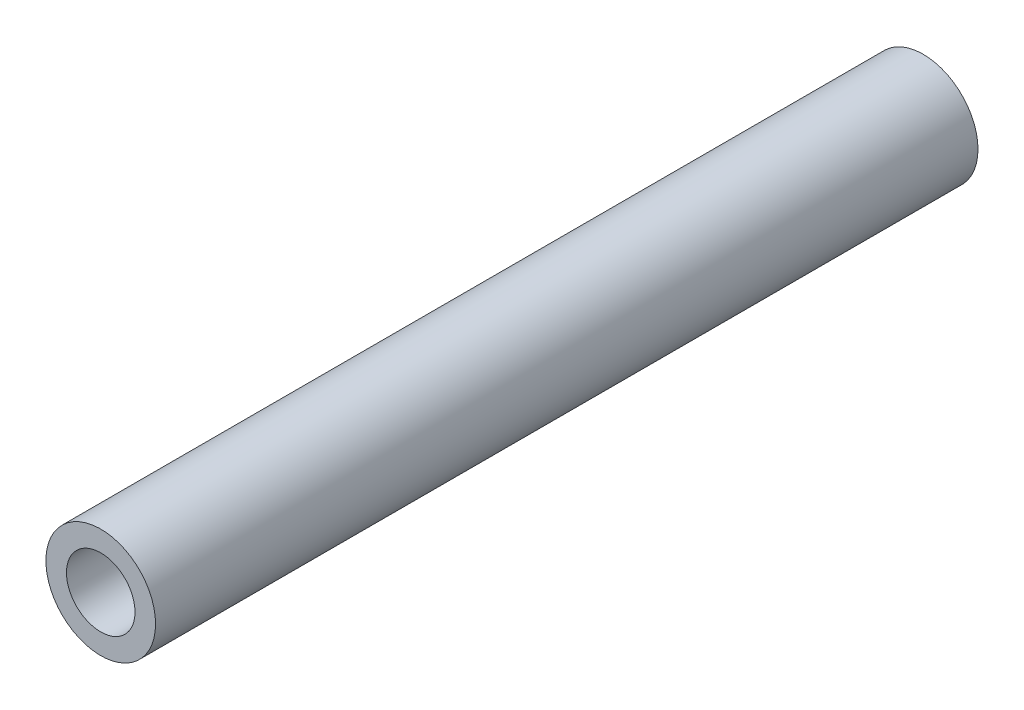
ISO-10303-21;
HEADER;
FILE_DESCRIPTION(('STEP AP214'),'2;1');
FILE_NAME('part.step','',(''),(''),'','','');
FILE_SCHEMA(('AUTOMOTIVE_DESIGN { 1 0 10303 214 1 1 1 1 }'));
ENDSEC;
DATA;
#1=APPLICATION_CONTEXT('core data for automotive mechanical design processes');
#2=APPLICATION_PROTOCOL_DEFINITION('international standard','automotive_design',2000,#1);
#3=PRODUCT_CONTEXT('',#1,'mechanical');
#4=PRODUCT('Part','Part','',(#3));
#5=PRODUCT_RELATED_PRODUCT_CATEGORY('part','',(#4));
#6=PRODUCT_DEFINITION_FORMATION('','',#4);
#7=PRODUCT_DEFINITION_CONTEXT('part definition',#1,'design');
#8=PRODUCT_DEFINITION('design','',#6,#7);
#9=PRODUCT_DEFINITION_SHAPE('','',#8);
#10=(LENGTH_UNIT() NAMED_UNIT(*) SI_UNIT(.MILLI.,.METRE.));
#11=(NAMED_UNIT(*) PLANE_ANGLE_UNIT() SI_UNIT($,.RADIAN.));
#12=(NAMED_UNIT(*) SI_UNIT($,.STERADIAN.) SOLID_ANGLE_UNIT());
#13=UNCERTAINTY_MEASURE_WITH_UNIT(LENGTH_MEASURE(1.E-05),#10,'distance_accuracy_value','');
#14=(GEOMETRIC_REPRESENTATION_CONTEXT(3) GLOBAL_UNCERTAINTY_ASSIGNED_CONTEXT((#13)) GLOBAL_UNIT_ASSIGNED_CONTEXT((#10,
#11,#12)) REPRESENTATION_CONTEXT('',''));
#15=CARTESIAN_POINT('',(0.,0.,0.));
#16=DIRECTION('',(0.,0.,1.));
#17=DIRECTION('',(1.,0.,0.));
#18=AXIS2_PLACEMENT_3D('',#15,#16,#17);
#19=CARTESIAN_POINT('',(0.,0.,30.));
#20=DIRECTION('',(0.,0.,1.));
#21=DIRECTION('',(1.,0.,0.));
#22=AXIS2_PLACEMENT_3D('',#19,#20,#21);
#23=PLANE('',#22);
#24=CARTESIAN_POINT('',(0.,0.,30.));
#25=DIRECTION('',(0.,0.,1.));
#26=DIRECTION('',(1.,0.,0.));
#27=AXIS2_PLACEMENT_3D('',#24,#25,#26);
#28=CIRCLE('',#27,2.);
#29=CARTESIAN_POINT('',(2.,0.,30.));
#30=VERTEX_POINT('',#29);
#31=EDGE_CURVE('E10',#30,#30,#28,.T.);
#32=ORIENTED_EDGE('',*,*,#31,.T.);
#33=EDGE_LOOP('',(#32));
#34=FACE_BOUND('',#33,.T.);
#35=CARTESIAN_POINT('',(0.,0.,30.));
#36=DIRECTION('',(0.,0.,1.));
#37=DIRECTION('',(1.,0.,0.));
#38=AXIS2_PLACEMENT_3D('',#35,#36,#37);
#39=CIRCLE('',#38,1.25);
#40=CARTESIAN_POINT('',(1.25,0.,30.));
#41=VERTEX_POINT('',#40);
#42=EDGE_CURVE('E41',#41,#41,#39,.T.);
#43=ORIENTED_EDGE('',*,*,#42,.F.);
#44=EDGE_LOOP('',(#43));
#45=FACE_BOUND('',#44,.T.);
#46=ADVANCED_FACE('F30',(#34,#45),#23,.T.);
#47=CARTESIAN_POINT('',(0.,0.,0.));
#48=DIRECTION('',(0.,0.,1.));
#49=DIRECTION('',(1.,0.,0.));
#50=AXIS2_PLACEMENT_3D('',#47,#48,#49);
#51=PLANE('',#50);
#52=CARTESIAN_POINT('',(0.,0.,0.));
#53=DIRECTION('',(0.,0.,1.));
#54=DIRECTION('',(1.,0.,0.));
#55=AXIS2_PLACEMENT_3D('',#52,#53,#54);
#56=CIRCLE('',#55,2.);
#57=CARTESIAN_POINT('',(2.,0.,0.));
#58=VERTEX_POINT('',#57);
#59=EDGE_CURVE('E34',#58,#58,#56,.T.);
#60=ORIENTED_EDGE('',*,*,#59,.F.);
#61=EDGE_LOOP('',(#60));
#62=FACE_BOUND('',#61,.T.);
#63=CARTESIAN_POINT('',(0.,0.,0.));
#64=DIRECTION('',(0.,0.,1.));
#65=DIRECTION('',(1.,0.,0.));
#66=AXIS2_PLACEMENT_3D('',#63,#64,#65);
#67=CIRCLE('',#66,1.25);
#68=CARTESIAN_POINT('',(1.25,0.,0.));
#69=VERTEX_POINT('',#68);
#70=EDGE_CURVE('E43',#69,#69,#67,.T.);
#71=ORIENTED_EDGE('',*,*,#70,.T.);
#72=EDGE_LOOP('',(#71));
#73=FACE_BOUND('',#72,.T.);
#74=ADVANCED_FACE('F53',(#62,#73),#51,.F.);
#75=CARTESIAN_POINT('',(0.,0.,30.));
#76=DIRECTION('',(0.,0.,-1.));
#77=DIRECTION('',(-1.,0.,0.));
#78=AXIS2_PLACEMENT_3D('',#75,#76,#77);
#79=CYLINDRICAL_SURFACE('',#78,2.);
#80=ORIENTED_EDGE('',*,*,#31,.F.);
#81=EDGE_LOOP('',(#80));
#82=FACE_BOUND('',#81,.T.);
#83=ORIENTED_EDGE('',*,*,#59,.T.);
#84=EDGE_LOOP('',(#83));
#85=FACE_BOUND('',#84,.T.);
#86=ADVANCED_FACE('F32',(#82,#85),#79,.T.);
#87=CARTESIAN_POINT('',(0.,0.,30.));
#88=DIRECTION('',(0.,0.,-1.));
#89=DIRECTION('',(-1.,0.,0.));
#90=AXIS2_PLACEMENT_3D('',#87,#88,#89);
#91=CYLINDRICAL_SURFACE('',#90,1.25);
#92=ORIENTED_EDGE('',*,*,#42,.T.);
#93=EDGE_LOOP('',(#92));
#94=FACE_BOUND('',#93,.T.);
#95=ORIENTED_EDGE('',*,*,#70,.F.);
#96=EDGE_LOOP('',(#95));
#97=FACE_BOUND('',#96,.T.);
#98=ADVANCED_FACE('F49',(#94,#97),#91,.F.);
#99=CLOSED_SHELL('',(#46,#74,#86,#98));
#100=MANIFOLD_SOLID_BREP('B2',#99);
#101=ADVANCED_BREP_SHAPE_REPRESENTATION('',(#18,#100),#14);
#102=SHAPE_DEFINITION_REPRESENTATION(#9,#101);
ENDSEC;
END-ISO-10303-21;
